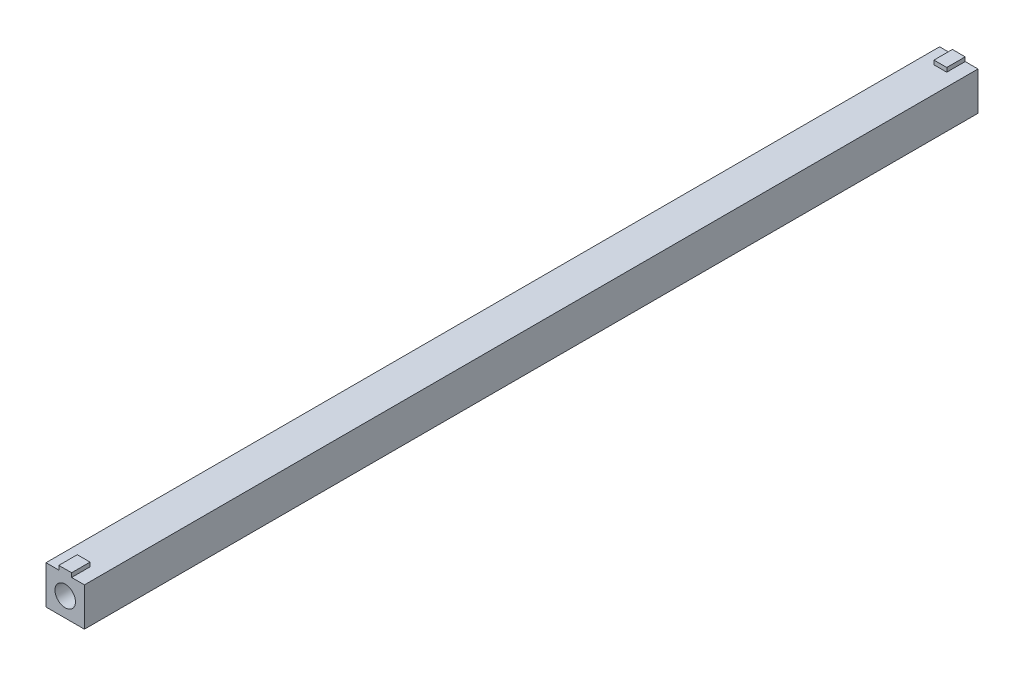
ISO-10303-21;
HEADER;
FILE_DESCRIPTION(('STEP AP214'),'2;1');
FILE_NAME('part.step','',(''),(''),'','','');
FILE_SCHEMA(('AUTOMOTIVE_DESIGN { 1 0 10303 214 1 1 1 1 }'));
ENDSEC;
DATA;
#1=APPLICATION_CONTEXT('core data for automotive mechanical design processes');
#2=APPLICATION_PROTOCOL_DEFINITION('international standard','automotive_design',2000,#1);
#3=PRODUCT_CONTEXT('',#1,'mechanical');
#4=PRODUCT('Part','Part','',(#3));
#5=PRODUCT_RELATED_PRODUCT_CATEGORY('part','',(#4));
#6=PRODUCT_DEFINITION_FORMATION('','',#4);
#7=PRODUCT_DEFINITION_CONTEXT('part definition',#1,'design');
#8=PRODUCT_DEFINITION('design','',#6,#7);
#9=PRODUCT_DEFINITION_SHAPE('','',#8);
#10=(LENGTH_UNIT() NAMED_UNIT(*) SI_UNIT(.MILLI.,.METRE.));
#11=(NAMED_UNIT(*) PLANE_ANGLE_UNIT() SI_UNIT($,.RADIAN.));
#12=(NAMED_UNIT(*) SI_UNIT($,.STERADIAN.) SOLID_ANGLE_UNIT());
#13=UNCERTAINTY_MEASURE_WITH_UNIT(LENGTH_MEASURE(1.E-05),#10,'distance_accuracy_value','');
#14=(GEOMETRIC_REPRESENTATION_CONTEXT(3) GLOBAL_UNCERTAINTY_ASSIGNED_CONTEXT((#13)) GLOBAL_UNIT_ASSIGNED_CONTEXT((#10,
#11,#12)) REPRESENTATION_CONTEXT('',''));
#15=CARTESIAN_POINT('',(0.,0.,0.));
#16=DIRECTION('',(0.,0.,1.));
#17=DIRECTION('',(1.,0.,0.));
#18=AXIS2_PLACEMENT_3D('',#15,#16,#17);
#19=CARTESIAN_POINT('',(-15.,15.,697.8));
#20=DIRECTION('',(0.,-1.,0.));
#21=DIRECTION('',(1.,0.,0.));
#22=AXIS2_PLACEMENT_3D('',#19,#20,#21);
#23=PLANE('',#22);
#24=DIRECTION('',(0.,0.,-1.));
#25=VECTOR('',#24,1.);
#26=CARTESIAN_POINT('',(-5.,15.,14.4));
#27=LINE('',#26,#25);
#28=CARTESIAN_POINT('',(-5.,15.,14.4));
#29=VERTEX_POINT('',#28);
#30=CARTESIAN_POINT('',(-5.,15.,0.));
#31=VERTEX_POINT('',#30);
#32=EDGE_CURVE('E152',#29,#31,#27,.T.);
#33=ORIENTED_EDGE('',*,*,#32,.T.);
#34=DIRECTION('',(-1.,0.,0.));
#35=VECTOR('',#34,1.);
#36=CARTESIAN_POINT('',(-15.,15.,0.));
#37=LINE('',#36,#35);
#38=CARTESIAN_POINT('',(-15.,15.,0.));
#39=VERTEX_POINT('',#38);
#40=EDGE_CURVE('E244',#31,#39,#37,.T.);
#41=ORIENTED_EDGE('',*,*,#40,.T.);
#42=DIRECTION('',(0.,0.,-1.));
#43=VECTOR('',#42,1.);
#44=CARTESIAN_POINT('',(-15.,15.,697.8));
#45=LINE('',#44,#43);
#46=CARTESIAN_POINT('',(-15.,15.,697.8));
#47=VERTEX_POINT('',#46);
#48=EDGE_CURVE('E48',#47,#39,#45,.T.);
#49=ORIENTED_EDGE('',*,*,#48,.F.);
#50=DIRECTION('',(-1.,0.,0.));
#51=VECTOR('',#50,1.);
#52=CARTESIAN_POINT('',(-15.,15.,697.8));
#53=LINE('',#52,#51);
#54=CARTESIAN_POINT('',(-5.,15.,697.8));
#55=VERTEX_POINT('',#54);
#56=EDGE_CURVE('E228',#55,#47,#53,.T.);
#57=ORIENTED_EDGE('',*,*,#56,.F.);
#58=DIRECTION('',(0.,0.,1.));
#59=VECTOR('',#58,1.);
#60=CARTESIAN_POINT('',(-5.,15.,683.4));
#61=LINE('',#60,#59);
#62=CARTESIAN_POINT('',(-5.,15.,683.4));
#63=VERTEX_POINT('',#62);
#64=EDGE_CURVE('E192',#63,#55,#61,.T.);
#65=ORIENTED_EDGE('',*,*,#64,.F.);
#66=DIRECTION('',(1.,0.,0.));
#67=VECTOR('',#66,1.);
#68=CARTESIAN_POINT('',(-5.,15.,683.4));
#69=LINE('',#68,#67);
#70=CARTESIAN_POINT('',(5.,15.,683.4));
#71=VERTEX_POINT('',#70);
#72=EDGE_CURVE('E179',#63,#71,#69,.T.);
#73=ORIENTED_EDGE('',*,*,#72,.T.);
#74=DIRECTION('',(0.,0.,1.));
#75=VECTOR('',#74,1.);
#76=CARTESIAN_POINT('',(5.,15.,683.4));
#77=LINE('',#76,#75);
#78=CARTESIAN_POINT('',(5.,15.,697.8));
#79=VERTEX_POINT('',#78);
#80=EDGE_CURVE('E210',#71,#79,#77,.T.);
#81=ORIENTED_EDGE('',*,*,#80,.T.);
#82=CARTESIAN_POINT('',(15.,15.,697.8));
#83=VERTEX_POINT('',#82);
#84=EDGE_CURVE('E230',#83,#79,#53,.T.);
#85=ORIENTED_EDGE('',*,*,#84,.F.);
#86=DIRECTION('',(0.,0.,-1.));
#87=VECTOR('',#86,1.);
#88=CARTESIAN_POINT('',(15.,15.,697.8));
#89=LINE('',#88,#87);
#90=CARTESIAN_POINT('',(15.,15.,0.));
#91=VERTEX_POINT('',#90);
#92=EDGE_CURVE('E11',#83,#91,#89,.T.);
#93=ORIENTED_EDGE('',*,*,#92,.T.);
#94=CARTESIAN_POINT('',(5.,15.,0.));
#95=VERTEX_POINT('',#94);
#96=EDGE_CURVE('E245',#91,#95,#37,.T.);
#97=ORIENTED_EDGE('',*,*,#96,.T.);
#98=DIRECTION('',(0.,0.,-1.));
#99=VECTOR('',#98,1.);
#100=CARTESIAN_POINT('',(5.,15.,14.4));
#101=LINE('',#100,#99);
#102=CARTESIAN_POINT('',(5.,15.,14.4));
#103=VERTEX_POINT('',#102);
#104=EDGE_CURVE('E60',#103,#95,#101,.T.);
#105=ORIENTED_EDGE('',*,*,#104,.F.);
#106=DIRECTION('',(1.,0.,0.));
#107=VECTOR('',#106,1.);
#108=CARTESIAN_POINT('',(-5.,15.,14.4));
#109=LINE('',#108,#107);
#110=EDGE_CURVE('E55',#29,#103,#109,.T.);
#111=ORIENTED_EDGE('',*,*,#110,.F.);
#112=EDGE_LOOP('',(#33,#41,#49,#57,#65,#73,#81,#85,#93,#97,#105,#111));
#113=FACE_BOUND('',#112,.T.);
#114=ADVANCED_FACE('F39',(#113),#23,.F.);
#115=CARTESIAN_POINT('',(0.,0.,697.8));
#116=DIRECTION('',(0.,0.,1.));
#117=DIRECTION('',(1.,0.,0.));
#118=AXIS2_PLACEMENT_3D('',#115,#116,#117);
#119=PLANE('',#118);
#120=DIRECTION('',(0.,1.,0.));
#121=VECTOR('',#120,1.);
#122=CARTESIAN_POINT('',(15.,15.,697.8));
#123=LINE('',#122,#121);
#124=CARTESIAN_POINT('',(15.,-15.,697.8));
#125=VERTEX_POINT('',#124);
#126=EDGE_CURVE('E224',#125,#83,#123,.T.);
#127=ORIENTED_EDGE('',*,*,#126,.T.);
#128=ORIENTED_EDGE('',*,*,#84,.T.);
#129=DIRECTION('',(0.,1.,0.));
#130=VECTOR('',#129,1.);
#131=CARTESIAN_POINT('',(5.,15.,697.8));
#132=LINE('',#131,#130);
#133=CARTESIAN_POINT('',(5.,18.2,697.8));
#134=VERTEX_POINT('',#133);
#135=EDGE_CURVE('E196',#79,#134,#132,.T.);
#136=ORIENTED_EDGE('',*,*,#135,.T.);
#137=DIRECTION('',(-1.,0.,0.));
#138=VECTOR('',#137,1.);
#139=CARTESIAN_POINT('',(-5.,18.2,697.8));
#140=LINE('',#139,#138);
#141=CARTESIAN_POINT('',(-5.,18.2,697.8));
#142=VERTEX_POINT('',#141);
#143=EDGE_CURVE('E180',#134,#142,#140,.T.);
#144=ORIENTED_EDGE('',*,*,#143,.T.);
#145=DIRECTION('',(0.,-1.,0.));
#146=VECTOR('',#145,1.);
#147=CARTESIAN_POINT('',(-5.,15.,697.8));
#148=LINE('',#147,#146);
#149=EDGE_CURVE('E170',#142,#55,#148,.T.);
#150=ORIENTED_EDGE('',*,*,#149,.T.);
#151=ORIENTED_EDGE('',*,*,#56,.T.);
#152=DIRECTION('',(0.,-1.,0.));
#153=VECTOR('',#152,1.);
#154=CARTESIAN_POINT('',(-15.,15.,697.8));
#155=LINE('',#154,#153);
#156=CARTESIAN_POINT('',(-15.,-15.,697.8));
#157=VERTEX_POINT('',#156);
#158=EDGE_CURVE('E234',#47,#157,#155,.T.);
#159=ORIENTED_EDGE('',*,*,#158,.T.);
#160=DIRECTION('',(1.,0.,0.));
#161=VECTOR('',#160,1.);
#162=CARTESIAN_POINT('',(-15.,-15.,697.8));
#163=LINE('',#162,#161);
#164=EDGE_CURVE('E237',#157,#125,#163,.T.);
#165=ORIENTED_EDGE('',*,*,#164,.T.);
#166=EDGE_LOOP('',(#127,#128,#136,#144,#150,#151,#159,#165));
#167=FACE_BOUND('',#166,.T.);
#168=CARTESIAN_POINT('',(0.,0.,697.8));
#169=DIRECTION('',(0.,0.,1.));
#170=DIRECTION('',(1.,0.,0.));
#171=AXIS2_PLACEMENT_3D('',#168,#169,#170);
#172=CIRCLE('',#171,8.);
#173=CARTESIAN_POINT('',(8.,0.,697.8));
#174=VERTEX_POINT('',#173);
#175=EDGE_CURVE('E216',#174,#174,#172,.T.);
#176=ORIENTED_EDGE('',*,*,#175,.F.);
#177=EDGE_LOOP('',(#176));
#178=FACE_BOUND('',#177,.T.);
#179=ADVANCED_FACE('F281',(#167,#178),#119,.T.);
#180=CARTESIAN_POINT('',(0.,0.,0.));
#181=DIRECTION('',(0.,0.,1.));
#182=DIRECTION('',(1.,0.,0.));
#183=AXIS2_PLACEMENT_3D('',#180,#181,#182);
#184=PLANE('',#183);
#185=DIRECTION('',(0.,1.,0.));
#186=VECTOR('',#185,1.);
#187=CARTESIAN_POINT('',(15.,15.,0.));
#188=LINE('',#187,#186);
#189=CARTESIAN_POINT('',(15.,-15.,0.));
#190=VERTEX_POINT('',#189);
#191=EDGE_CURVE('E220',#190,#91,#188,.T.);
#192=ORIENTED_EDGE('',*,*,#191,.F.);
#193=DIRECTION('',(1.,0.,0.));
#194=VECTOR('',#193,1.);
#195=CARTESIAN_POINT('',(-15.,-15.,0.));
#196=LINE('',#195,#194);
#197=CARTESIAN_POINT('',(-15.,-15.,0.));
#198=VERTEX_POINT('',#197);
#199=EDGE_CURVE('E229',#198,#190,#196,.T.);
#200=ORIENTED_EDGE('',*,*,#199,.F.);
#201=DIRECTION('',(0.,-1.,0.));
#202=VECTOR('',#201,1.);
#203=CARTESIAN_POINT('',(-15.,15.,0.));
#204=LINE('',#203,#202);
#205=EDGE_CURVE('E248',#39,#198,#204,.T.);
#206=ORIENTED_EDGE('',*,*,#205,.F.);
#207=ORIENTED_EDGE('',*,*,#40,.F.);
#208=DIRECTION('',(0.,-1.,0.));
#209=VECTOR('',#208,1.);
#210=CARTESIAN_POINT('',(-5.,15.,0.));
#211=LINE('',#210,#209);
#212=CARTESIAN_POINT('',(-5.,18.2,0.));
#213=VERTEX_POINT('',#212);
#214=EDGE_CURVE('E163',#213,#31,#211,.T.);
#215=ORIENTED_EDGE('',*,*,#214,.F.);
#216=DIRECTION('',(-1.,0.,0.));
#217=VECTOR('',#216,1.);
#218=CARTESIAN_POINT('',(-5.,18.2,0.));
#219=LINE('',#218,#217);
#220=CARTESIAN_POINT('',(5.,18.2,0.));
#221=VERTEX_POINT('',#220);
#222=EDGE_CURVE('E144',#221,#213,#219,.T.);
#223=ORIENTED_EDGE('',*,*,#222,.F.);
#224=DIRECTION('',(0.,1.,0.));
#225=VECTOR('',#224,1.);
#226=CARTESIAN_POINT('',(5.,15.,0.));
#227=LINE('',#226,#225);
#228=EDGE_CURVE('E154',#95,#221,#227,.T.);
#229=ORIENTED_EDGE('',*,*,#228,.F.);
#230=ORIENTED_EDGE('',*,*,#96,.F.);
#231=EDGE_LOOP('',(#192,#200,#206,#207,#215,#223,#229,#230));
#232=FACE_BOUND('',#231,.T.);
#233=CARTESIAN_POINT('',(0.,0.,0.));
#234=DIRECTION('',(0.,0.,1.));
#235=DIRECTION('',(1.,0.,0.));
#236=AXIS2_PLACEMENT_3D('',#233,#234,#235);
#237=CIRCLE('',#236,8.);
#238=CARTESIAN_POINT('',(8.,0.,0.));
#239=VERTEX_POINT('',#238);
#240=EDGE_CURVE('E206',#239,#239,#237,.T.);
#241=ORIENTED_EDGE('',*,*,#240,.T.);
#242=EDGE_LOOP('',(#241));
#243=FACE_BOUND('',#242,.T.);
#244=ADVANCED_FACE('F271',(#232,#243),#184,.F.);
#245=CARTESIAN_POINT('',(15.,15.,697.8));
#246=DIRECTION('',(-1.,0.,0.));
#247=DIRECTION('',(0.,-1.,0.));
#248=AXIS2_PLACEMENT_3D('',#245,#246,#247);
#249=PLANE('',#248);
#250=ORIENTED_EDGE('',*,*,#191,.T.);
#251=ORIENTED_EDGE('',*,*,#92,.F.);
#252=ORIENTED_EDGE('',*,*,#126,.F.);
#253=DIRECTION('',(0.,0.,-1.));
#254=VECTOR('',#253,1.);
#255=CARTESIAN_POINT('',(15.,-15.,697.8));
#256=LINE('',#255,#254);
#257=EDGE_CURVE('E240',#125,#190,#256,.T.);
#258=ORIENTED_EDGE('',*,*,#257,.T.);
#259=EDGE_LOOP('',(#250,#251,#252,#258));
#260=FACE_BOUND('',#259,.T.);
#261=ADVANCED_FACE('F41',(#260),#249,.F.);
#262=CARTESIAN_POINT('',(-15.,15.,697.8));
#263=DIRECTION('',(1.,0.,0.));
#264=DIRECTION('',(0.,1.,0.));
#265=AXIS2_PLACEMENT_3D('',#262,#263,#264);
#266=PLANE('',#265);
#267=ORIENTED_EDGE('',*,*,#205,.T.);
#268=DIRECTION('',(0.,0.,-1.));
#269=VECTOR('',#268,1.);
#270=CARTESIAN_POINT('',(-15.,-15.,697.8));
#271=LINE('',#270,#269);
#272=EDGE_CURVE('E256',#157,#198,#271,.T.);
#273=ORIENTED_EDGE('',*,*,#272,.F.);
#274=ORIENTED_EDGE('',*,*,#158,.F.);
#275=ORIENTED_EDGE('',*,*,#48,.T.);
#276=EDGE_LOOP('',(#267,#273,#274,#275));
#277=FACE_BOUND('',#276,.T.);
#278=ADVANCED_FACE('F265',(#277),#266,.F.);
#279=CARTESIAN_POINT('',(-15.,-15.,697.8));
#280=DIRECTION('',(0.,1.,0.));
#281=DIRECTION('',(0.,0.,1.));
#282=AXIS2_PLACEMENT_3D('',#279,#280,#281);
#283=PLANE('',#282);
#284=ORIENTED_EDGE('',*,*,#199,.T.);
#285=ORIENTED_EDGE('',*,*,#257,.F.);
#286=ORIENTED_EDGE('',*,*,#164,.F.);
#287=ORIENTED_EDGE('',*,*,#272,.T.);
#288=EDGE_LOOP('',(#284,#285,#286,#287));
#289=FACE_BOUND('',#288,.T.);
#290=ADVANCED_FACE('F275',(#289),#283,.F.);
#291=CARTESIAN_POINT('',(0.,0.,697.8));
#292=DIRECTION('',(0.,0.,-1.));
#293=DIRECTION('',(-1.,0.,0.));
#294=AXIS2_PLACEMENT_3D('',#291,#292,#293);
#295=CYLINDRICAL_SURFACE('',#294,8.);
#296=ORIENTED_EDGE('',*,*,#175,.T.);
#297=EDGE_LOOP('',(#296));
#298=FACE_BOUND('',#297,.T.);
#299=ORIENTED_EDGE('',*,*,#240,.F.);
#300=EDGE_LOOP('',(#299));
#301=FACE_BOUND('',#300,.T.);
#302=ADVANCED_FACE('F310',(#298,#301),#295,.F.);
#303=CARTESIAN_POINT('',(-5.,15.,683.4));
#304=DIRECTION('',(-1.,0.,0.));
#305=DIRECTION('',(0.,0.,1.));
#306=AXIS2_PLACEMENT_3D('',#303,#304,#305);
#307=PLANE('',#306);
#308=ORIENTED_EDGE('',*,*,#149,.F.);
#309=DIRECTION('',(0.,0.,1.));
#310=VECTOR('',#309,1.);
#311=CARTESIAN_POINT('',(-5.,18.2,683.4));
#312=LINE('',#311,#310);
#313=CARTESIAN_POINT('',(-5.,18.2,683.4));
#314=VERTEX_POINT('',#313);
#315=EDGE_CURVE('E203',#314,#142,#312,.T.);
#316=ORIENTED_EDGE('',*,*,#315,.F.);
#317=DIRECTION('',(0.,-1.,0.));
#318=VECTOR('',#317,1.);
#319=CARTESIAN_POINT('',(-5.,15.,683.4));
#320=LINE('',#319,#318);
#321=EDGE_CURVE('E175',#314,#63,#320,.T.);
#322=ORIENTED_EDGE('',*,*,#321,.T.);
#323=ORIENTED_EDGE('',*,*,#64,.T.);
#324=EDGE_LOOP('',(#308,#316,#322,#323));
#325=FACE_BOUND('',#324,.T.);
#326=ADVANCED_FACE('F315',(#325),#307,.T.);
#327=CARTESIAN_POINT('',(-5.,18.2,683.4));
#328=DIRECTION('',(0.,1.,0.));
#329=DIRECTION('',(-1.,0.,0.));
#330=AXIS2_PLACEMENT_3D('',#327,#328,#329);
#331=PLANE('',#330);
#332=ORIENTED_EDGE('',*,*,#143,.F.);
#333=DIRECTION('',(0.,0.,1.));
#334=VECTOR('',#333,1.);
#335=CARTESIAN_POINT('',(5.,18.2,683.4));
#336=LINE('',#335,#334);
#337=CARTESIAN_POINT('',(5.,18.2,683.4));
#338=VERTEX_POINT('',#337);
#339=EDGE_CURVE('E207',#338,#134,#336,.T.);
#340=ORIENTED_EDGE('',*,*,#339,.F.);
#341=DIRECTION('',(-1.,0.,0.));
#342=VECTOR('',#341,1.);
#343=CARTESIAN_POINT('',(-5.,18.2,683.4));
#344=LINE('',#343,#342);
#345=EDGE_CURVE('E188',#338,#314,#344,.T.);
#346=ORIENTED_EDGE('',*,*,#345,.T.);
#347=ORIENTED_EDGE('',*,*,#315,.T.);
#348=EDGE_LOOP('',(#332,#340,#346,#347));
#349=FACE_BOUND('',#348,.T.);
#350=ADVANCED_FACE('F319',(#349),#331,.T.);
#351=CARTESIAN_POINT('',(5.,15.,683.4));
#352=DIRECTION('',(1.,0.,0.));
#353=DIRECTION('',(0.,0.,-1.));
#354=AXIS2_PLACEMENT_3D('',#351,#352,#353);
#355=PLANE('',#354);
#356=ORIENTED_EDGE('',*,*,#135,.F.);
#357=ORIENTED_EDGE('',*,*,#80,.F.);
#358=DIRECTION('',(0.,1.,0.));
#359=VECTOR('',#358,1.);
#360=CARTESIAN_POINT('',(5.,15.,683.4));
#361=LINE('',#360,#359);
#362=EDGE_CURVE('E184',#71,#338,#361,.T.);
#363=ORIENTED_EDGE('',*,*,#362,.T.);
#364=ORIENTED_EDGE('',*,*,#339,.T.);
#365=EDGE_LOOP('',(#356,#357,#363,#364));
#366=FACE_BOUND('',#365,.T.);
#367=ADVANCED_FACE('F321',(#366),#355,.T.);
#368=CARTESIAN_POINT('',(0.,0.,683.4));
#369=DIRECTION('',(0.,0.,-1.));
#370=DIRECTION('',(-1.,0.,0.));
#371=AXIS2_PLACEMENT_3D('',#368,#369,#370);
#372=PLANE('',#371);
#373=ORIENTED_EDGE('',*,*,#321,.F.);
#374=ORIENTED_EDGE('',*,*,#345,.F.);
#375=ORIENTED_EDGE('',*,*,#362,.F.);
#376=ORIENTED_EDGE('',*,*,#72,.F.);
#377=EDGE_LOOP('',(#373,#374,#375,#376));
#378=FACE_BOUND('',#377,.T.);
#379=ADVANCED_FACE('F297',(#378),#372,.T.);
#380=CARTESIAN_POINT('',(-5.,15.,14.4));
#381=DIRECTION('',(1.,0.,0.));
#382=DIRECTION('',(0.,0.,-1.));
#383=AXIS2_PLACEMENT_3D('',#380,#381,#382);
#384=PLANE('',#383);
#385=ORIENTED_EDGE('',*,*,#214,.T.);
#386=ORIENTED_EDGE('',*,*,#32,.F.);
#387=DIRECTION('',(0.,-1.,0.));
#388=VECTOR('',#387,1.);
#389=CARTESIAN_POINT('',(-5.,15.,14.4));
#390=LINE('',#389,#388);
#391=CARTESIAN_POINT('',(-5.,18.2,14.4));
#392=VERTEX_POINT('',#391);
#393=EDGE_CURVE('E131',#392,#29,#390,.T.);
#394=ORIENTED_EDGE('',*,*,#393,.F.);
#395=DIRECTION('',(0.,0.,-1.));
#396=VECTOR('',#395,1.);
#397=CARTESIAN_POINT('',(-5.,18.2,14.4));
#398=LINE('',#397,#396);
#399=EDGE_CURVE('E141',#392,#213,#398,.T.);
#400=ORIENTED_EDGE('',*,*,#399,.T.);
#401=EDGE_LOOP('',(#385,#386,#394,#400));
#402=FACE_BOUND('',#401,.T.);
#403=ADVANCED_FACE('F151',(#402),#384,.F.);
#404=CARTESIAN_POINT('',(5.,15.,14.4));
#405=DIRECTION('',(-1.,0.,0.));
#406=DIRECTION('',(0.,0.,1.));
#407=AXIS2_PLACEMENT_3D('',#404,#405,#406);
#408=PLANE('',#407);
#409=ORIENTED_EDGE('',*,*,#228,.T.);
#410=DIRECTION('',(0.,0.,-1.));
#411=VECTOR('',#410,1.);
#412=CARTESIAN_POINT('',(5.,18.2,14.4));
#413=LINE('',#412,#411);
#414=CARTESIAN_POINT('',(5.,18.2,14.4));
#415=VERTEX_POINT('',#414);
#416=EDGE_CURVE('E149',#415,#221,#413,.T.);
#417=ORIENTED_EDGE('',*,*,#416,.F.);
#418=DIRECTION('',(0.,1.,0.));
#419=VECTOR('',#418,1.);
#420=CARTESIAN_POINT('',(5.,15.,14.4));
#421=LINE('',#420,#419);
#422=EDGE_CURVE('E134',#103,#415,#421,.T.);
#423=ORIENTED_EDGE('',*,*,#422,.F.);
#424=ORIENTED_EDGE('',*,*,#104,.T.);
#425=EDGE_LOOP('',(#409,#417,#423,#424));
#426=FACE_BOUND('',#425,.T.);
#427=ADVANCED_FACE('F289',(#426),#408,.F.);
#428=CARTESIAN_POINT('',(-5.,18.2,14.4));
#429=DIRECTION('',(0.,-1.,0.));
#430=DIRECTION('',(1.,0.,0.));
#431=AXIS2_PLACEMENT_3D('',#428,#429,#430);
#432=PLANE('',#431);
#433=ORIENTED_EDGE('',*,*,#222,.T.);
#434=ORIENTED_EDGE('',*,*,#399,.F.);
#435=DIRECTION('',(-1.,0.,0.));
#436=VECTOR('',#435,1.);
#437=CARTESIAN_POINT('',(-5.,18.2,14.4));
#438=LINE('',#437,#436);
#439=EDGE_CURVE('E127',#415,#392,#438,.T.);
#440=ORIENTED_EDGE('',*,*,#439,.F.);
#441=ORIENTED_EDGE('',*,*,#416,.T.);
#442=EDGE_LOOP('',(#433,#434,#440,#441));
#443=FACE_BOUND('',#442,.T.);
#444=ADVANCED_FACE('F142',(#443),#432,.F.);
#445=CARTESIAN_POINT('',(0.,0.,14.4));
#446=DIRECTION('',(0.,0.,1.));
#447=DIRECTION('',(-1.,0.,0.));
#448=AXIS2_PLACEMENT_3D('',#445,#446,#447);
#449=PLANE('',#448);
#450=ORIENTED_EDGE('',*,*,#393,.T.);
#451=ORIENTED_EDGE('',*,*,#110,.T.);
#452=ORIENTED_EDGE('',*,*,#422,.T.);
#453=ORIENTED_EDGE('',*,*,#439,.T.);
#454=EDGE_LOOP('',(#450,#451,#452,#453));
#455=FACE_BOUND('',#454,.T.);
#456=ADVANCED_FACE('F129',(#455),#449,.T.);
#457=CLOSED_SHELL('',(#114,#179,#244,#261,#278,#290,#302,#326,#350,#367,#379,#403,#427,#444,#456));
#458=MANIFOLD_SOLID_BREP('B2',#457);
#459=ADVANCED_BREP_SHAPE_REPRESENTATION('',(#18,#458),#14);
#460=SHAPE_DEFINITION_REPRESENTATION(#9,#459);
ENDSEC;
END-ISO-10303-21;
